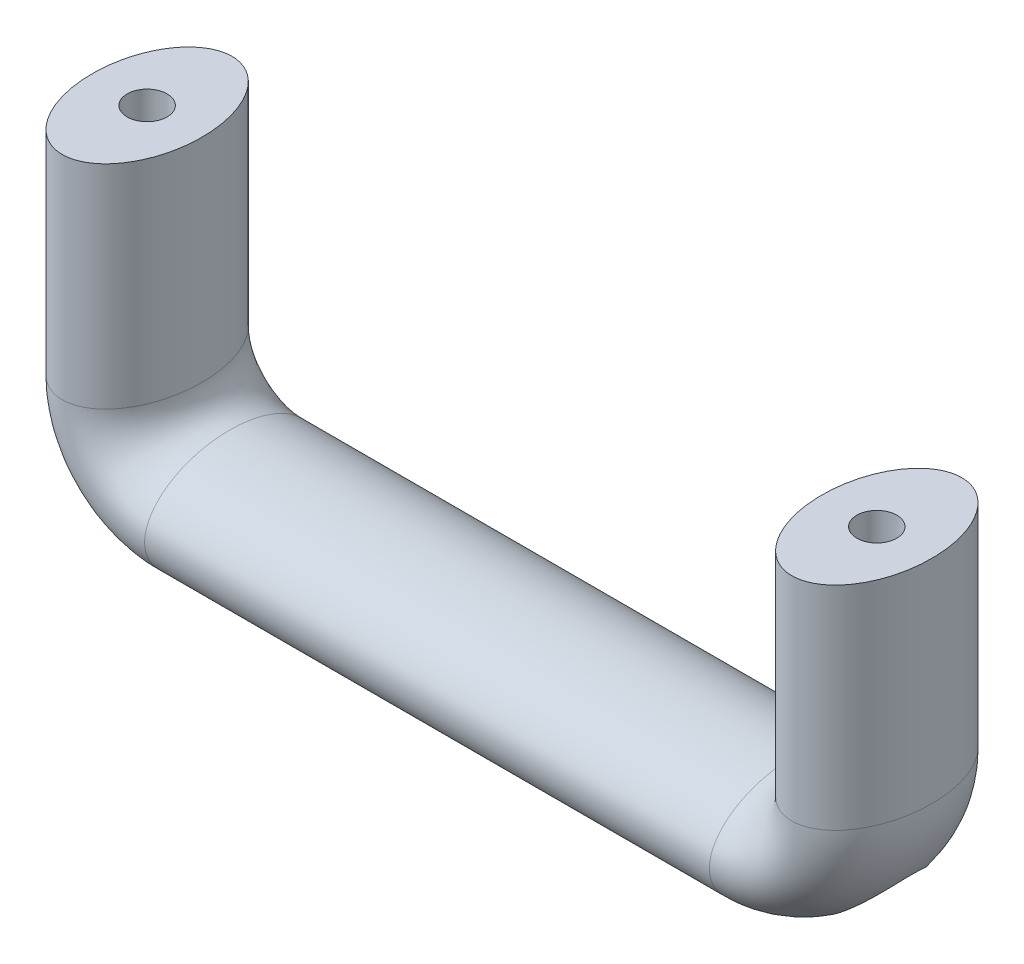
ISO-10303-21;
HEADER;
FILE_DESCRIPTION(('STEP AP214'),'2;1');
FILE_NAME('part.step','',(''),(''),'','','');
FILE_SCHEMA(('AUTOMOTIVE_DESIGN { 1 0 10303 214 1 1 1 1 }'));
ENDSEC;
DATA;
#1=APPLICATION_CONTEXT('core data for automotive mechanical design processes');
#2=APPLICATION_PROTOCOL_DEFINITION('international standard','automotive_design',2000,#1);
#3=PRODUCT_CONTEXT('',#1,'mechanical');
#4=PRODUCT('Part','Part','',(#3));
#5=PRODUCT_RELATED_PRODUCT_CATEGORY('part','',(#4));
#6=PRODUCT_DEFINITION_FORMATION('','',#4);
#7=PRODUCT_DEFINITION_CONTEXT('part definition',#1,'design');
#8=PRODUCT_DEFINITION('design','',#6,#7);
#9=PRODUCT_DEFINITION_SHAPE('','',#8);
#10=(LENGTH_UNIT() NAMED_UNIT(*) SI_UNIT(.MILLI.,.METRE.));
#11=(NAMED_UNIT(*) PLANE_ANGLE_UNIT() SI_UNIT($,.RADIAN.));
#12=(NAMED_UNIT(*) SI_UNIT($,.STERADIAN.) SOLID_ANGLE_UNIT());
#13=UNCERTAINTY_MEASURE_WITH_UNIT(LENGTH_MEASURE(1.E-05),#10,'distance_accuracy_value','');
#14=(GEOMETRIC_REPRESENTATION_CONTEXT(3) GLOBAL_UNCERTAINTY_ASSIGNED_CONTEXT((#13)) GLOBAL_UNIT_ASSIGNED_CONTEXT((#10,
#11,#12)) REPRESENTATION_CONTEXT('',''));
#15=CARTESIAN_POINT('',(0.,0.,0.));
#16=DIRECTION('',(0.,0.,1.));
#17=DIRECTION('',(1.,0.,0.));
#18=AXIS2_PLACEMENT_3D('',#15,#16,#17);
#19=CARTESIAN_POINT('',(44.846875,0.,0.));
#20=DIRECTION('',(-1.,0.,0.));
#21=DIRECTION('',(0.,0.,-1.));
#22=AXIS2_PLACEMENT_3D('',#19,#20,#21);
#23=ELLIPSE('',#22,13.49375,8.73125);
#24=CARTESIAN_POINT('',(44.846875,13.096875,0.));
#25=DIRECTION('',(0.,0.,1.));
#26=AXIS1_PLACEMENT('',#24,#25);
#27=SURFACE_OF_REVOLUTION('',#23,#26);
#28=CARTESIAN_POINT('',(57.94375,13.096875,0.));
#29=DIRECTION('',(0.,-1.,0.));
#30=DIRECTION('',(0.,0.,-1.));
#31=AXIS2_PLACEMENT_3D('',#28,#29,#30);
#32=ELLIPSE('',#31,13.49375,8.73125);
#33=CARTESIAN_POINT('',(57.94375,13.096875,-13.49375));
#34=VERTEX_POINT('',#33);
#35=EDGE_CURVE('E42',#34,#34,#32,.T.);
#36=ORIENTED_EDGE('',*,*,#35,.T.);
#37=EDGE_LOOP('',(#36));
#38=FACE_BOUND('',#37,.T.);
#39=CARTESIAN_POINT('',(44.846875,0.,-13.49375));
#40=VERTEX_POINT('',#39);
#41=EDGE_CURVE('E47',#40,#40,#23,.T.);
#42=ORIENTED_EDGE('',*,*,#41,.F.);
#43=EDGE_LOOP('',(#42));
#44=FACE_BOUND('',#43,.T.);
#45=CARTESIAN_POINT('',(57.94375,-3.35139645855794,5.65113228089492));
#46=CARTESIAN_POINT('',(57.5746862352443,-3.64331484991546,5.65622519553315));
#47=CARTESIAN_POINT('',(57.2017922048101,-3.93187821364346,5.62510913077977));
#48=CARTESIAN_POINT('',(56.4591436932699,-4.49534407066536,5.48636690939444));
#49=CARTESIAN_POINT('',(56.089392824493,-4.77023224919793,5.37866231327861));
#50=CARTESIAN_POINT('',(55.4301100486153,-5.25161833408054,5.10845063150673));
#51=CARTESIAN_POINT('',(55.1379149551523,-5.46163688524343,4.95892865764341));
#52=CARTESIAN_POINT('',(54.7156864742835,-5.76098728724267,4.69252106700156));
#53=CARTESIAN_POINT('',(54.5776550010241,-5.85813449635496,4.5967283140944));
#54=CARTESIAN_POINT('',(54.3082135148788,-6.04651114356533,4.39098811090377));
#55=CARTESIAN_POINT('',(54.1768022596839,-6.13774169287724,4.2810433301717));
#56=CARTESIAN_POINT('',(53.9431283241811,-6.29894968395207,4.06636693460569));
#57=CARTESIAN_POINT('',(53.8396258322547,-6.36995509553836,3.96375092498246));
#58=CARTESIAN_POINT('',(53.639330432146,-6.5066811680028,3.74891159318105));
#59=CARTESIAN_POINT('',(53.5425362634089,-6.57240282212045,3.63669008486975));
#60=CARTESIAN_POINT('',(53.3566565258166,-6.69803060520064,3.40291296489685));
#61=CARTESIAN_POINT('',(53.2675730277214,-6.75793517246283,3.28135486226144));
#62=CARTESIAN_POINT('',(53.0982542633905,-6.87131706059435,3.02946746882609));
#63=CARTESIAN_POINT('',(53.0180151394527,-6.92479718457222,2.89914204238443));
#64=CARTESIAN_POINT('',(52.8668596930951,-7.02517009004666,2.62934311436904));
#65=CARTESIAN_POINT('',(52.7960171936901,-7.07201088746454,2.48980875149418));
#66=CARTESIAN_POINT('',(52.6654662066914,-7.15805644554019,2.20344311700573));
#67=CARTESIAN_POINT('',(52.6057522043009,-7.19726498884077,2.05661550554288));
#68=CARTESIAN_POINT('',(52.4984160823366,-7.26756242855203,1.75677062058317));
#69=CARTESIAN_POINT('',(52.4507901219438,-7.29865390414604,1.60375533110088));
#70=CARTESIAN_POINT('',(52.3684557004544,-7.35230331972591,1.29283525150155));
#71=CARTESIAN_POINT('',(52.3337453548846,-7.37486250463711,1.13493117833494));
#72=CARTESIAN_POINT('',(52.2813317265114,-7.40888813089281,0.835452004227387));
#73=CARTESIAN_POINT('',(52.2620586546155,-7.42137968036328,0.69426552081927));
#74=CARTESIAN_POINT('',(52.2342159663788,-7.43941705334638,0.410404859934935));
#75=CARTESIAN_POINT('',(52.2256454135125,-7.4449634845928,0.267730813729984));
#76=CARTESIAN_POINT('',(52.2193387909664,-7.44904531121297,-0.0179023497551686));
#77=CARTESIAN_POINT('',(52.2215987221754,-7.44758329442709,-0.160861342332628));
#78=CARTESIAN_POINT('',(52.236909290931,-7.4376714198211,-0.445955303378311));
#79=CARTESIAN_POINT('',(52.249959708039,-7.42922170475251,-0.588090288620429));
#80=CARTESIAN_POINT('',(52.2855116547916,-7.40617326468082,-0.861629296697843));
#81=CARTESIAN_POINT('',(52.3073763540154,-7.39198871127046,-0.993151838559297));
#82=CARTESIAN_POINT('',(52.3601456751799,-7.35769761074963,-1.25362761654654));
#83=CARTESIAN_POINT('',(52.3910531775246,-7.33758917669139,-1.38258002000516));
#84=CARTESIAN_POINT('',(52.4615051732639,-7.29165506418565,-1.63700242977126));
#85=CARTESIAN_POINT('',(52.5010464568889,-7.26583151039233,-1.76247371076497));
#86=CARTESIAN_POINT('',(52.5883155590524,-7.20869165922185,-2.00929565450592));
#87=CARTESIAN_POINT('',(52.6360464806332,-7.17737327976105,-2.1306447344017));
#88=CARTESIAN_POINT('',(52.7409092281882,-7.10836418517364,-2.37259129045033));
#89=CARTESIAN_POINT('',(52.7983057148844,-7.07049287205383,-2.49302262966009));
#90=CARTESIAN_POINT('',(52.9206332922722,-6.98950038382196,-2.72817706646486));
#91=CARTESIAN_POINT('',(52.9855670871499,-6.94637732424806,-2.84289809412894));
#92=CARTESIAN_POINT('',(53.1906646485962,-6.80965232774162,-3.17769692485344));
#93=CARTESIAN_POINT('',(53.3411885450254,-6.70865270849993,-3.38855576181128));
#94=CARTESIAN_POINT('',(53.6822529254597,-6.47771845915544,-3.80459845382586));
#95=CARTESIAN_POINT('',(53.8753828964691,-6.34581423256014,-4.00653633013496));
#96=CARTESIAN_POINT('',(54.2820021722722,-6.06501802974557,-4.37490856480491));
#97=CARTESIAN_POINT('',(54.4955017713485,-5.91611745646769,-4.54132483246578));
#98=CARTESIAN_POINT('',(54.9731854477444,-5.57905116058154,-4.86292076445452));
#99=CARTESIAN_POINT('',(55.2399276665458,-5.38845665352498,-5.01174165344912));
#100=CARTESIAN_POINT('',(55.7849824122992,-4.99338149729163,-5.26211568687435));
#101=CARTESIAN_POINT('',(56.0633024375841,-4.78889179287347,-5.36363766232649));
#102=CARTESIAN_POINT('',(56.6773693074658,-4.33090574373172,-5.5357665841157));
#103=CARTESIAN_POINT('',(57.0141848062598,-4.07535928850034,-5.59713498962475));
#104=CARTESIAN_POINT('',(57.6864527775785,-3.55554816853501,-5.65893024440136));
#105=CARTESIAN_POINT('',(58.0219046675849,-3.29128014409589,-5.65933332806654));
#106=CARTESIAN_POINT('',(58.7361811143557,-2.71688721523872,-5.59730819310959));
#107=CARTESIAN_POINT('',(59.1136322098959,-2.4060255677166,-5.52509314704713));
#108=CARTESIAN_POINT('',(59.663871599542,-1.94084695002296,-5.36056189575608));
#109=CARTESIAN_POINT('',(59.8448698444611,-1.785757475468,-5.29622084456571));
#110=CARTESIAN_POINT('',(60.2003128045396,-1.47694966583241,-5.14892791016937));
#111=CARTESIAN_POINT('',(60.3747600309393,-1.32323082293248,-5.06598324519564));
#112=CARTESIAN_POINT('',(60.7263340105782,-1.00891185445445,-4.87590219489734));
#113=CARTESIAN_POINT('',(60.9029683594406,-0.848468263753688,-4.76759368315906));
#114=CARTESIAN_POINT('',(61.2459200446552,-0.531954610887161,-4.52997681915638));
#115=CARTESIAN_POINT('',(61.4122340036779,-0.375885989487468,-4.40066164206158));
#116=CARTESIAN_POINT('',(61.7322144312152,-0.0707069763788393,-4.12115393523975));
#117=CARTESIAN_POINT('',(61.8859127593697,0.0784205040987224,-3.97101674454352));
#118=CARTESIAN_POINT('',(62.1788534631866,0.367263300217282,-3.64925507373258));
#119=CARTESIAN_POINT('',(62.318108852157,0.506987048195195,-3.47765024938209));
#120=CARTESIAN_POINT('',(62.520541466433,0.71324224821284,-3.19478111562703));
#121=CARTESIAN_POINT('',(62.5897356928283,0.784395946510264,-3.09114975672581));
#122=CARTESIAN_POINT('',(62.7223648886976,0.921905785578775,-2.87724289540268));
#123=CARTESIAN_POINT('',(62.785798808676,0.988261051655594,-2.76696618829985));
#124=CARTESIAN_POINT('',(62.9663148135529,1.17856811983095,-2.4264104764598));
#125=CARTESIAN_POINT('',(63.0739632488377,1.29412237704825,-2.1859228820124));
#126=CARTESIAN_POINT('',(63.2030292914658,1.43425766855676,-1.83036491673055));
#127=CARTESIAN_POINT('',(63.2378141205121,1.47224781543923,-1.72515384237925));
#128=CARTESIAN_POINT('',(63.3015824159837,1.5421909780118,-1.51104585144048));
#129=CARTESIAN_POINT('',(63.3305687495886,1.57414697696395,-1.4021507877716));
#130=CARTESIAN_POINT('',(63.3822687215338,1.63134047865389,-1.18120331796847));
#131=CARTESIAN_POINT('',(63.4049852535588,1.65658108053637,-1.06915239475343));
#132=CARTESIAN_POINT('',(63.4437475352799,1.6997566265956,-0.842502193013307));
#133=CARTESIAN_POINT('',(63.4597932831257,1.71769156874594,-0.727902913781377));
#134=CARTESIAN_POINT('',(63.4849567556749,1.74585732570925,-0.496281963698674));
#135=CARTESIAN_POINT('',(63.4940316510284,1.75604050985405,-0.37924978461998));
#136=CARTESIAN_POINT('',(63.504885835534,1.76822366824493,-0.144419204378824));
#137=CARTESIAN_POINT('',(63.5066651437777,1.77022366390523,-0.0266208052222572));
#138=CARTESIAN_POINT('',(63.5028866488298,1.76598021005941,0.208706432723477));
#139=CARTESIAN_POINT('',(63.497328902332,1.7597368242503,0.326235273588504));
#140=CARTESIAN_POINT('',(63.4790048378968,1.73919309326544,0.560010934420706));
#141=CARTESIAN_POINT('',(63.4662387259382,1.72489297831064,0.676257790923801));
#142=CARTESIAN_POINT('',(63.4352629582737,1.69030051110051,0.896022802814127));
#143=CARTESIAN_POINT('',(63.4176577017692,1.67067554620761,0.999733007849442));
#144=CARTESIAN_POINT('',(63.3770172770203,1.62553178099309,1.2047939894004));
#145=CARTESIAN_POINT('',(63.3539805031205,1.60001123787651,1.30614405846358));
#146=CARTESIAN_POINT('',(63.2772276330673,1.51533734959317,1.60589935539579));
#147=CARTESIAN_POINT('',(63.2158562157328,1.44805730120443,1.80009736744077));
#148=CARTESIAN_POINT('',(63.0431441158188,1.2608942461327,2.26133004651359));
#149=CARTESIAN_POINT('',(62.9218156028281,1.13106722060269,2.52058688298708));
#150=CARTESIAN_POINT('',(62.7178680048301,0.917197851565908,2.88549522176264));
#151=CARTESIAN_POINT('',(62.6460978115208,0.842589202424818,3.00329928082404));
#152=CARTESIAN_POINT('',(62.4959573769173,0.688046768843261,3.23099585070756));
#153=CARTESIAN_POINT('',(62.4175870588503,0.608112922462228,3.3408882694737));
#154=CARTESIAN_POINT('',(62.2238402615612,0.412501351146365,3.59332867813045));
#155=CARTESIAN_POINT('',(62.1057773551536,0.294849029071406,3.73228418476919));
#156=CARTESIAN_POINT('',(61.8599051920726,0.0533210061801411,3.99540923799337));
#157=CARTESIAN_POINT('',(61.7320922810649,-0.0705570220575956,4.11957319554807));
#158=CARTESIAN_POINT('',(61.4678839873147,-0.323026521376802,4.35342033010985));
#159=CARTESIAN_POINT('',(61.3314812645225,-0.451621983270919,4.46309086752118));
#160=CARTESIAN_POINT('',(61.0512904612334,-0.712145439635563,4.6679813489947));
#161=CARTESIAN_POINT('',(60.9075033063041,-0.844073015409268,4.76320309818592));
#162=CARTESIAN_POINT('',(60.6098205027622,-1.11357558010536,4.94148055930924));
#163=CARTESIAN_POINT('',(60.4557627628513,-1.25120953313015,5.02417691887301));
#164=CARTESIAN_POINT('',(60.14179911891,-1.52805269888568,5.17450483365191));
#165=CARTESIAN_POINT('',(59.9818908910877,-1.66726252204687,5.24213032546185));
#166=CARTESIAN_POINT('',(59.4954217241965,-2.08548130845453,5.42195289411207));
#167=CARTESIAN_POINT('',(59.1612453860202,-2.36586798938232,5.51161256803678));
#168=CARTESIAN_POINT('',(58.6768021254843,-2.76325372293138,5.59495137368489));
#169=CARTESIAN_POINT('',(58.5313675977308,-2.8814237919284,5.61417225347589));
#170=CARTESIAN_POINT('',(58.2387440143734,-3.11704100408854,5.64124554992532));
#171=CARTESIAN_POINT('',(58.0915541705862,-3.23448778359762,5.64909264954702));
#172=CARTESIAN_POINT('',(57.94375,-3.35139645855794,5.65113228089492));
#173=B_SPLINE_CURVE_WITH_KNOTS('',3,(#45,#46,#47,#48,#49,#50,#51,#52,#53,#54,#55,#56,#57,#58,
#59,#60,#61,#62,#63,#64,#65,#66,#67,#68,#69,#70,#71,#72,#73,#74,#75,#76,#77,#78,#79,#80,#81,#82,
#83,#84,#85,#86,#87,#88,#89,#90,#91,#92,#93,#94,#95,#96,#97,#98,#99,#100,#101,#102,#103,#104,
#105,#106,#107,#108,#109,#110,#111,#112,#113,#114,#115,#116,#117,#118,#119,#120,#121,#122,#123,
#124,#125,#126,#127,#128,#129,#130,#131,#132,#133,#134,#135,#136,#137,#138,#139,#140,#141,#142,
#143,#144,#145,#146,#147,#148,#149,#150,#151,#152,#153,#154,#155,#156,#157,#158,#159,#160,#161,
#162,#163,#164,#165,#166,#167,#168,#169,#170,#171,#172),.UNSPECIFIED.,.T.,.F.,(4,2,2,2,2,2,2,2,
2,2,2,2,2,2,2,2,2,2,2,2,2,2,2,2,2,2,2,2,2,2,2,2,2,2,2,2,2,2,2,2,2,2,2,2,2,2,2,2,2,2,2,2,2,2,2,2,
2,2,2,2,2,2,2,4),(0.,1.41111007229615,2.82366744301005,3.98755962621132,4.56920162734131,
5.15073407145271,5.63664129605417,6.12245696531231,6.60840270190919,7.09413563490757,
7.58348333757699,8.07258789229663,8.56153684526881,9.0504144293666,9.47898354810835,
9.90751516221341,10.335888554988,10.7642531967485,11.1660323126791,11.5679395468991,
11.9696976182315,12.3716082526611,12.7871973631257,13.2029360394884,14.0339260934466,
14.9574416515499,15.8814264279707,16.9575059262115,18.0342935384597,19.3109886092656,
20.5881813621692,22.064115807902,22.8041507155958,23.5438989837466,24.3290389040961,
25.1144344196622,25.89778121059,26.6804159478302,27.1105641551174,27.5407905764215,
28.3991658149661,28.7503324785309,29.1013250693082,29.4521553954991,29.8029858190017,
30.1559548969575,30.5089230512436,30.8618884781437,31.2148438195718,31.5355294349061,
31.8563099698643,32.4976045519201,33.4350446215554,33.9052262883417,34.3754134250483,
35.0254955241874,35.6758224848663,36.3267128996194,36.9775219296739,37.6444351547059,
38.3116162139519,39.6421618319169,40.2070250044675,40.772152155272),.UNSPECIFIED.);
#174=CARTESIAN_POINT('',(57.94375,-3.35139645855794,5.65113228089492));
#175=VERTEX_POINT('',#174);
#176=EDGE_CURVE('E35',#175,#175,#173,.T.);
#177=ORIENTED_EDGE('',*,*,#176,.F.);
#178=EDGE_LOOP('',(#177));
#179=FACE_BOUND('',#178,.T.);
#180=ADVANCED_FACE('F30',(#38,#44,#179),#27,.T.);
#181=CARTESIAN_POINT('',(57.94375,46.83125,0.));
#182=DIRECTION('',(0.,-1.,0.));
#183=DIRECTION('',(0.,0.,1.));
#184=AXIS2_PLACEMENT_3D('',#181,#182,#183);
#185=PLANE('',#184);
#186=CARTESIAN_POINT('',(57.94375,46.83125,0.));
#187=DIRECTION('',(0.,-1.,0.));
#188=DIRECTION('',(0.,0.,-1.));
#189=AXIS2_PLACEMENT_3D('',#186,#187,#188);
#190=ELLIPSE('',#189,13.49375,8.73125);
#191=CARTESIAN_POINT('',(57.94375,46.83125,-13.49375));
#192=VERTEX_POINT('',#191);
#193=EDGE_CURVE('E10',#192,#192,#190,.T.);
#194=ORIENTED_EDGE('',*,*,#193,.F.);
#195=EDGE_LOOP('',(#194));
#196=FACE_BOUND('',#195,.T.);
#197=CARTESIAN_POINT('',(57.94375,46.83125,0.));
#198=DIRECTION('',(0.,-1.,0.));
#199=DIRECTION('',(0.,0.,1.));
#200=AXIS2_PLACEMENT_3D('',#197,#198,#199);
#201=CIRCLE('',#200,3.17499999999997);
#202=CARTESIAN_POINT('',(57.94375,46.83125,3.17499999999997));
#203=VERTEX_POINT('',#202);
#204=EDGE_CURVE('E121',#203,#203,#201,.T.);
#205=ORIENTED_EDGE('',*,*,#204,.T.);
#206=EDGE_LOOP('',(#205));
#207=FACE_BOUND('',#206,.T.);
#208=ADVANCED_FACE('F82',(#196,#207),#185,.F.);
#209=DIRECTION('',(0.,1.,0.));
#210=VECTOR('',#209,1.);
#211=SURFACE_OF_LINEAR_EXTRUSION('',#32,#210);
#212=ORIENTED_EDGE('',*,*,#35,.F.);
#213=EDGE_LOOP('',(#212));
#214=FACE_BOUND('',#213,.T.);
#215=ORIENTED_EDGE('',*,*,#193,.T.);
#216=EDGE_LOOP('',(#215));
#217=FACE_BOUND('',#216,.T.);
#218=ADVANCED_FACE('F32',(#214,#217),#211,.F.);
#219=CARTESIAN_POINT('',(-44.846875,0.,0.));
#220=DIRECTION('',(-1.,0.,0.));
#221=DIRECTION('',(0.,0.,-1.));
#222=AXIS2_PLACEMENT_3D('',#219,#220,#221);
#223=ELLIPSE('',#222,13.49375,8.73125);
#224=DIRECTION('',(1.,0.,0.));
#225=VECTOR('',#224,1.);
#226=SURFACE_OF_LINEAR_EXTRUSION('',#223,#225);
#227=CARTESIAN_POINT('',(-44.846875,0.,-13.49375));
#228=VERTEX_POINT('',#227);
#229=EDGE_CURVE('E96',#228,#228,#223,.T.);
#230=ORIENTED_EDGE('',*,*,#229,.F.);
#231=EDGE_LOOP('',(#230));
#232=FACE_BOUND('',#231,.T.);
#233=ORIENTED_EDGE('',*,*,#41,.T.);
#234=EDGE_LOOP('',(#233));
#235=FACE_BOUND('',#234,.T.);
#236=ADVANCED_FACE('F105',(#232,#235),#226,.F.);
#237=CARTESIAN_POINT('',(-57.94375,13.096875,0.));
#238=DIRECTION('',(0.,1.,0.));
#239=DIRECTION('',(0.,0.,-1.));
#240=AXIS2_PLACEMENT_3D('',#237,#238,#239);
#241=ELLIPSE('',#240,13.49375,8.73125);
#242=CARTESIAN_POINT('',(-44.846875,13.096875,0.));
#243=DIRECTION('',(0.,0.,1.));
#244=AXIS1_PLACEMENT('',#242,#243);
#245=SURFACE_OF_REVOLUTION('',#241,#244);
#246=CARTESIAN_POINT('',(-57.94375,-3.35139645855795,5.65113228089492));
#247=CARTESIAN_POINT('',(-57.5746862352443,-3.64331484991546,5.65622519553315));
#248=CARTESIAN_POINT('',(-57.2017922048101,-3.93187821364346,5.62510913077977));
#249=CARTESIAN_POINT('',(-56.4591436932699,-4.49534407066536,5.48636690939444));
#250=CARTESIAN_POINT('',(-56.089392824493,-4.77023224919793,5.37866231327861));
#251=CARTESIAN_POINT('',(-55.4301100486153,-5.25161833408054,5.10845063150673));
#252=CARTESIAN_POINT('',(-55.1379149551523,-5.46163688524343,4.9589286576434));
#253=CARTESIAN_POINT('',(-54.7156864742835,-5.76098728724268,4.69252106700156));
#254=CARTESIAN_POINT('',(-54.5776550010241,-5.85813449635496,4.5967283140944));
#255=CARTESIAN_POINT('',(-54.3082135148788,-6.04651114356534,4.39098811090378));
#256=CARTESIAN_POINT('',(-54.1768022596839,-6.13774169287725,4.28104333017171));
#257=CARTESIAN_POINT('',(-53.9431283241811,-6.29894968395207,4.06636693460569));
#258=CARTESIAN_POINT('',(-53.8396258322547,-6.36995509553836,3.96375092498246));
#259=CARTESIAN_POINT('',(-53.639330432146,-6.50668116800279,3.74891159318105));
#260=CARTESIAN_POINT('',(-53.5425362634089,-6.57240282212044,3.63669008486976));
#261=CARTESIAN_POINT('',(-53.3566565258166,-6.69803060520064,3.40291296489686));
#262=CARTESIAN_POINT('',(-53.2675730277214,-6.75793517246283,3.28135486226144));
#263=CARTESIAN_POINT('',(-53.0982542633905,-6.87131706059435,3.0294674688261));
#264=CARTESIAN_POINT('',(-53.0180151394527,-6.92479718457222,2.89914204238444));
#265=CARTESIAN_POINT('',(-52.8668596930951,-7.02517009004666,2.62934311436904));
#266=CARTESIAN_POINT('',(-52.7960171936901,-7.07201088746455,2.48980875149418));
#267=CARTESIAN_POINT('',(-52.6654662066914,-7.1580564455402,2.20344311700574));
#268=CARTESIAN_POINT('',(-52.6057522043009,-7.19726498884078,2.05661550554288));
#269=CARTESIAN_POINT('',(-52.4984160823366,-7.26756242855203,1.75677062058317));
#270=CARTESIAN_POINT('',(-52.4507901219438,-7.29865390414605,1.60375533110088));
#271=CARTESIAN_POINT('',(-52.3684557004544,-7.35230331972592,1.29283525150155));
#272=CARTESIAN_POINT('',(-52.3337453548846,-7.37486250463711,1.13493117833494));
#273=CARTESIAN_POINT('',(-52.2813317265114,-7.40888813089282,0.835452004227387));
#274=CARTESIAN_POINT('',(-52.2620586546155,-7.42137968036328,0.69426552081927));
#275=CARTESIAN_POINT('',(-52.2342159663788,-7.43941705334638,0.410404859934936));
#276=CARTESIAN_POINT('',(-52.2256454135125,-7.4449634845928,0.267730813729984));
#277=CARTESIAN_POINT('',(-52.2193387909664,-7.44904531121297,-0.0179023497551689));
#278=CARTESIAN_POINT('',(-52.2215987221754,-7.4475832944271,-0.160861342332629));
#279=CARTESIAN_POINT('',(-52.236909290931,-7.43767141982112,-0.445955303378312));
#280=CARTESIAN_POINT('',(-52.249959708039,-7.42922170475252,-0.588090288620428));
#281=CARTESIAN_POINT('',(-52.2855116547917,-7.40617326468083,-0.861629296697843));
#282=CARTESIAN_POINT('',(-52.3073763540154,-7.39198871127047,-0.993151838559298));
#283=CARTESIAN_POINT('',(-52.3601456751799,-7.35769761074963,-1.25362761654654));
#284=CARTESIAN_POINT('',(-52.3910531775246,-7.33758917669139,-1.38258002000516));
#285=CARTESIAN_POINT('',(-52.4615051732639,-7.29165506418566,-1.63700242977126));
#286=CARTESIAN_POINT('',(-52.5010464568889,-7.26583151039234,-1.76247371076497));
#287=CARTESIAN_POINT('',(-52.5883155590524,-7.20869165922187,-2.00929565450592));
#288=CARTESIAN_POINT('',(-52.6360464806332,-7.17737327976107,-2.1306447344017));
#289=CARTESIAN_POINT('',(-52.7409092281882,-7.10836418517365,-2.37259129045032));
#290=CARTESIAN_POINT('',(-52.7983057148844,-7.07049287205383,-2.49302262966009));
#291=CARTESIAN_POINT('',(-52.9206332922722,-6.98950038382197,-2.72817706646486));
#292=CARTESIAN_POINT('',(-52.9855670871499,-6.94637732424807,-2.84289809412894));
#293=CARTESIAN_POINT('',(-53.1906646485962,-6.80965232774163,-3.17769692485344));
#294=CARTESIAN_POINT('',(-53.3411885450254,-6.70865270849994,-3.38855576181128));
#295=CARTESIAN_POINT('',(-53.6822529254597,-6.47771845915545,-3.80459845382586));
#296=CARTESIAN_POINT('',(-53.8753828964691,-6.34581423256016,-4.00653633013496));
#297=CARTESIAN_POINT('',(-54.2820021722722,-6.06501802974558,-4.37490856480491));
#298=CARTESIAN_POINT('',(-54.4955017713485,-5.9161174564677,-4.54132483246578));
#299=CARTESIAN_POINT('',(-54.9731854477444,-5.57905116058154,-4.86292076445452));
#300=CARTESIAN_POINT('',(-55.2399276665458,-5.38845665352498,-5.01174165344912));
#301=CARTESIAN_POINT('',(-55.7849824122992,-4.99338149729163,-5.26211568687435));
#302=CARTESIAN_POINT('',(-56.0633024375841,-4.78889179287347,-5.36363766232649));
#303=CARTESIAN_POINT('',(-56.6773693074658,-4.33090574373172,-5.5357665841157));
#304=CARTESIAN_POINT('',(-57.0141848062598,-4.07535928850034,-5.59713498962475));
#305=CARTESIAN_POINT('',(-57.6864527775785,-3.55554816853502,-5.65893024440136));
#306=CARTESIAN_POINT('',(-58.0219046675849,-3.29128014409589,-5.65933332806654));
#307=CARTESIAN_POINT('',(-58.7361811143557,-2.71688721523873,-5.59730819310959));
#308=CARTESIAN_POINT('',(-59.1136322098959,-2.40602556771662,-5.52509314704713));
#309=CARTESIAN_POINT('',(-59.663871599542,-1.94084695002298,-5.36056189575607));
#310=CARTESIAN_POINT('',(-59.8448698444611,-1.78575747546801,-5.29622084456571));
#311=CARTESIAN_POINT('',(-60.2003128045396,-1.47694966583242,-5.14892791016937));
#312=CARTESIAN_POINT('',(-60.3747600309393,-1.32323082293249,-5.06598324519564));
#313=CARTESIAN_POINT('',(-60.7263340105782,-1.00891185445446,-4.87590219489734));
#314=CARTESIAN_POINT('',(-60.9029683594406,-0.848468263753693,-4.76759368315906));
#315=CARTESIAN_POINT('',(-61.2459200446552,-0.531954610887166,-4.52997681915637));
#316=CARTESIAN_POINT('',(-61.4122340036779,-0.375885989487475,-4.40066164206158));
#317=CARTESIAN_POINT('',(-61.7322144312152,-0.0707069763788457,-4.12115393523975));
#318=CARTESIAN_POINT('',(-61.8859127593697,0.0784205040987181,-3.97101674454351));
#319=CARTESIAN_POINT('',(-62.1788534631866,0.367263300217278,-3.64925507373258));
#320=CARTESIAN_POINT('',(-62.318108852157,0.506987048195189,-3.47765024938209));
#321=CARTESIAN_POINT('',(-62.520541466433,0.713242248212834,-3.19478111562704));
#322=CARTESIAN_POINT('',(-62.5897356928283,0.784395946510259,-3.09114975672581));
#323=CARTESIAN_POINT('',(-62.7223648886976,0.921905785578769,-2.87724289540269));
#324=CARTESIAN_POINT('',(-62.785798808676,0.988261051655586,-2.76696618829986));
#325=CARTESIAN_POINT('',(-62.9663148135529,1.17856811983094,-2.4264104764598));
#326=CARTESIAN_POINT('',(-63.0739632488377,1.29412237704824,-2.18592288201241));
#327=CARTESIAN_POINT('',(-63.2030292914658,1.43425766855675,-1.83036491673055));
#328=CARTESIAN_POINT('',(-63.2378141205121,1.47224781543921,-1.72515384237926));
#329=CARTESIAN_POINT('',(-63.3015824159837,1.54219097801178,-1.51104585144048));
#330=CARTESIAN_POINT('',(-63.3305687495886,1.57414697696393,-1.4021507877716));
#331=CARTESIAN_POINT('',(-63.3822687215338,1.63134047865387,-1.18120331796847));
#332=CARTESIAN_POINT('',(-63.4049852535588,1.65658108053634,-1.06915239475343));
#333=CARTESIAN_POINT('',(-63.4437475352799,1.69975662659558,-0.842502193013307));
#334=CARTESIAN_POINT('',(-63.4597932831257,1.71769156874593,-0.727902913781377));
#335=CARTESIAN_POINT('',(-63.4849567556749,1.74585732570923,-0.496281963698673));
#336=CARTESIAN_POINT('',(-63.4940316510284,1.75604050985402,-0.379249784619979));
#337=CARTESIAN_POINT('',(-63.504885835534,1.7682236682449,-0.144419204378823));
#338=CARTESIAN_POINT('',(-63.5066651437777,1.77022366390523,-0.0266208052222566));
#339=CARTESIAN_POINT('',(-63.5028866488298,1.76598021005942,0.208706432723476));
#340=CARTESIAN_POINT('',(-63.4973289023321,1.75973682425029,0.326235273588503));
#341=CARTESIAN_POINT('',(-63.4790048378968,1.73919309326542,0.560010934420705));
#342=CARTESIAN_POINT('',(-63.4662387259382,1.72489297831063,0.676257790923801));
#343=CARTESIAN_POINT('',(-63.4352629582737,1.6903005111005,0.896022802814126));
#344=CARTESIAN_POINT('',(-63.4176577017692,1.67067554620759,0.99973300784944));
#345=CARTESIAN_POINT('',(-63.3770172770203,1.62553178099309,1.20479398940041));
#346=CARTESIAN_POINT('',(-63.3539805031206,1.60001123787653,1.30614405846359));
#347=CARTESIAN_POINT('',(-63.2772276330673,1.51533734959323,1.60589935539581));
#348=CARTESIAN_POINT('',(-63.2158562157329,1.44805730120446,1.80009736744078));
#349=CARTESIAN_POINT('',(-63.0431441158188,1.26089424613268,2.26133004651359));
#350=CARTESIAN_POINT('',(-62.9218156028281,1.13106722060268,2.52058688298708));
#351=CARTESIAN_POINT('',(-62.7178680048301,0.917197851565909,2.88549522176265));
#352=CARTESIAN_POINT('',(-62.6460978115208,0.842589202424817,3.00329928082405));
#353=CARTESIAN_POINT('',(-62.4959573769173,0.688046768843254,3.23099585070757));
#354=CARTESIAN_POINT('',(-62.4175870588503,0.608112922462219,3.3408882694737));
#355=CARTESIAN_POINT('',(-62.2238402615612,0.412501351146352,3.59332867813046));
#356=CARTESIAN_POINT('',(-62.1057773551536,0.294849029071394,3.73228418476919));
#357=CARTESIAN_POINT('',(-61.8599051920726,0.0533210061801335,3.99540923799337));
#358=CARTESIAN_POINT('',(-61.7320922810649,-0.0705570220576004,4.11957319554807));
#359=CARTESIAN_POINT('',(-61.4678839873147,-0.323026521376808,4.35342033010985));
#360=CARTESIAN_POINT('',(-61.3314812645225,-0.451621983270929,4.46309086752117));
#361=CARTESIAN_POINT('',(-61.0512904612334,-0.712145439635572,4.66798134899469));
#362=CARTESIAN_POINT('',(-60.9075033063041,-0.844073015409271,4.76320309818592));
#363=CARTESIAN_POINT('',(-60.6098205027622,-1.11357558010536,4.94148055930924));
#364=CARTESIAN_POINT('',(-60.4557627628513,-1.25120953313015,5.02417691887301));
#365=CARTESIAN_POINT('',(-60.14179911891,-1.52805269888568,5.17450483365191));
#366=CARTESIAN_POINT('',(-59.9818908910877,-1.66726252204687,5.24213032546185));
#367=CARTESIAN_POINT('',(-59.4954217241965,-2.08548130845454,5.42195289411206));
#368=CARTESIAN_POINT('',(-59.1612453860202,-2.36586798938232,5.51161256803678));
#369=CARTESIAN_POINT('',(-58.6768021254843,-2.76325372293139,5.59495137368489));
#370=CARTESIAN_POINT('',(-58.5313675977308,-2.8814237919284,5.61417225347589));
#371=CARTESIAN_POINT('',(-58.2387440143734,-3.11704100408855,5.64124554992532));
#372=CARTESIAN_POINT('',(-58.0915541705862,-3.23448778359763,5.64909264954702));
#373=CARTESIAN_POINT('',(-57.94375,-3.35139645855795,5.65113228089492));
#374=B_SPLINE_CURVE_WITH_KNOTS('',3,(#246,#247,#248,#249,#250,#251,#252,#253,#254,#255,#256,
#257,#258,#259,#260,#261,#262,#263,#264,#265,#266,#267,#268,#269,#270,#271,#272,#273,#274,#275,
#276,#277,#278,#279,#280,#281,#282,#283,#284,#285,#286,#287,#288,#289,#290,#291,#292,#293,#294,
#295,#296,#297,#298,#299,#300,#301,#302,#303,#304,#305,#306,#307,#308,#309,#310,#311,#312,#313,
#314,#315,#316,#317,#318,#319,#320,#321,#322,#323,#324,#325,#326,#327,#328,#329,#330,#331,#332,
#333,#334,#335,#336,#337,#338,#339,#340,#341,#342,#343,#344,#345,#346,#347,#348,#349,#350,#351,
#352,#353,#354,#355,#356,#357,#358,#359,#360,#361,#362,#363,#364,#365,#366,#367,#368,#369,#370,
#371,#372,#373),.UNSPECIFIED.,.T.,.F.,(4,2,2,2,2,2,2,2,2,2,2,2,2,2,2,2,2,2,2,2,2,2,2,2,2,2,2,2,
2,2,2,2,2,2,2,2,2,2,2,2,2,2,2,2,2,2,2,2,2,2,2,2,2,2,2,2,2,2,2,2,2,2,2,4),(0.,1.41111007229615,
2.82366744301005,3.98755962621132,4.56920162734131,5.1507340714527,5.63664129605417,
6.1224569653123,6.60840270190918,7.09413563490756,7.58348333757698,8.07258789229663,
8.56153684526881,9.0504144293666,9.47898354810835,9.90751516221341,10.335888554988,
10.7642531967485,11.1660323126791,11.5679395468991,11.9696976182315,12.3716082526611,
12.7871973631257,13.2029360394884,14.0339260934466,14.9574416515499,15.8814264279707,
16.9575059262115,18.0342935384597,19.3109886092656,20.5881813621692,22.064115807902,
22.8041507155958,23.5438989837466,24.3290389040961,25.1144344196622,25.89778121059,
26.6804159478302,27.1105641551173,27.5407905764215,28.3991658149661,28.7503324785309,
29.1013250693082,29.452155395499,29.8029858190017,30.1559548969575,30.5089230512436,
30.8618884781437,31.2148438195718,31.535529434906,31.8563099698643,32.4976045519201,
33.4350446215554,33.9052262883417,34.3754134250483,35.0254955241874,35.6758224848663,
36.3267128996194,36.9775219296739,37.6444351547059,38.3116162139519,39.6421618319169,
40.2070250044675,40.772152155272),.UNSPECIFIED.);
#375=CARTESIAN_POINT('',(-57.94375,-3.35139645855795,5.65113228089492));
#376=VERTEX_POINT('',#375);
#377=EDGE_CURVE('E54',#376,#376,#374,.T.);
#378=ORIENTED_EDGE('',*,*,#377,.T.);
#379=EDGE_LOOP('',(#378));
#380=FACE_BOUND('',#379,.T.);
#381=CARTESIAN_POINT('',(-57.94375,13.096875,-13.49375));
#382=VERTEX_POINT('',#381);
#383=EDGE_CURVE('E91',#382,#382,#241,.T.);
#384=ORIENTED_EDGE('',*,*,#383,.F.);
#385=EDGE_LOOP('',(#384));
#386=FACE_BOUND('',#385,.T.);
#387=ORIENTED_EDGE('',*,*,#229,.T.);
#388=EDGE_LOOP('',(#387));
#389=FACE_BOUND('',#388,.T.);
#390=ADVANCED_FACE('F63',(#380,#386,#389),#245,.T.);
#391=DIRECTION('',(0.,1.,0.));
#392=VECTOR('',#391,1.);
#393=SURFACE_OF_LINEAR_EXTRUSION('',#241,#392);
#394=ORIENTED_EDGE('',*,*,#383,.T.);
#395=EDGE_LOOP('',(#394));
#396=FACE_BOUND('',#395,.T.);
#397=CARTESIAN_POINT('',(-57.94375,46.83125,0.));
#398=DIRECTION('',(0.,1.,0.));
#399=DIRECTION('',(0.,0.,-1.));
#400=AXIS2_PLACEMENT_3D('',#397,#398,#399);
#401=ELLIPSE('',#400,13.49375,8.73125);
#402=CARTESIAN_POINT('',(-57.94375,46.83125,-13.49375));
#403=VERTEX_POINT('',#402);
#404=EDGE_CURVE('E97',#403,#403,#401,.T.);
#405=ORIENTED_EDGE('',*,*,#404,.F.);
#406=EDGE_LOOP('',(#405));
#407=FACE_BOUND('',#406,.T.);
#408=ADVANCED_FACE('F87',(#396,#407),#393,.T.);
#409=CARTESIAN_POINT('',(-57.94375,46.83125,0.));
#410=DIRECTION('',(0.,1.,0.));
#411=DIRECTION('',(0.,0.,1.));
#412=AXIS2_PLACEMENT_3D('',#409,#410,#411);
#413=PLANE('',#412);
#414=CARTESIAN_POINT('',(-57.94375,46.83125,0.));
#415=DIRECTION('',(0.,1.,0.));
#416=DIRECTION('',(0.,0.,1.));
#417=AXIS2_PLACEMENT_3D('',#414,#415,#416);
#418=CIRCLE('',#417,3.17499999999997);
#419=CARTESIAN_POINT('',(-57.94375,46.83125,3.17499999999997));
#420=VERTEX_POINT('',#419);
#421=EDGE_CURVE('E61',#420,#420,#418,.T.);
#422=ORIENTED_EDGE('',*,*,#421,.F.);
#423=EDGE_LOOP('',(#422));
#424=FACE_BOUND('',#423,.T.);
#425=ORIENTED_EDGE('',*,*,#404,.T.);
#426=EDGE_LOOP('',(#425));
#427=FACE_BOUND('',#426,.T.);
#428=ADVANCED_FACE('F80',(#424,#427),#413,.T.);
#429=CARTESIAN_POINT('',(-57.94375,29.36875,0.));
#430=DIRECTION('',(0.,1.,0.));
#431=DIRECTION('',(0.,0.,1.));
#432=AXIS2_PLACEMENT_3D('',#429,#430,#431);
#433=CYLINDRICAL_SURFACE('',#432,3.17499999999997);
#434=CARTESIAN_POINT('',(-57.94375,34.91865,0.));
#435=DIRECTION('',(0.,1.,0.));
#436=DIRECTION('',(0.,0.,1.));
#437=AXIS2_PLACEMENT_3D('',#434,#435,#436);
#438=CIRCLE('',#437,3.17499999999997);
#439=CARTESIAN_POINT('',(-57.94375,34.91865,3.17499999999997));
#440=VERTEX_POINT('',#439);
#441=EDGE_CURVE('E51',#440,#440,#438,.F.);
#442=CARTESIAN_POINT('',(-57.94375,34.91865,3.17499999999997));
#443=CARTESIAN_POINT('',(-57.94375,35.0427395833333,3.17499999999997));
#444=CARTESIAN_POINT('',(-57.94375,35.1668291666667,3.17499999999997));
#445=CARTESIAN_POINT('',(-57.94375,35.4150083333333,3.17499999999997));
#446=CARTESIAN_POINT('',(-57.94375,35.5390979166667,3.17499999999997));
#447=CARTESIAN_POINT('',(-57.94375,35.7872770833333,3.17499999999997));
#448=CARTESIAN_POINT('',(-57.94375,35.9113666666667,3.17499999999997));
#449=CARTESIAN_POINT('',(-57.94375,36.1595458333333,3.17499999999997));
#450=CARTESIAN_POINT('',(-57.94375,36.2836354166667,3.17499999999997));
#451=CARTESIAN_POINT('',(-57.94375,36.5318145833333,3.17499999999997));
#452=CARTESIAN_POINT('',(-57.94375,36.6559041666667,3.17499999999997));
#453=CARTESIAN_POINT('',(-57.94375,36.9040833333333,3.17499999999997));
#454=CARTESIAN_POINT('',(-57.94375,37.0281729166667,3.17499999999997));
#455=CARTESIAN_POINT('',(-57.94375,37.2763520833333,3.17499999999997));
#456=CARTESIAN_POINT('',(-57.94375,37.4004416666667,3.17499999999997));
#457=CARTESIAN_POINT('',(-57.94375,37.6486208333333,3.17499999999997));
#458=CARTESIAN_POINT('',(-57.94375,37.7727104166667,3.17499999999997));
#459=CARTESIAN_POINT('',(-57.94375,38.0208895833333,3.17499999999997));
#460=CARTESIAN_POINT('',(-57.94375,38.1449791666667,3.17499999999997));
#461=CARTESIAN_POINT('',(-57.94375,38.3931583333333,3.17499999999997));
#462=CARTESIAN_POINT('',(-57.94375,38.5172479166667,3.17499999999997));
#463=CARTESIAN_POINT('',(-57.94375,38.7654270833333,3.17499999999997));
#464=CARTESIAN_POINT('',(-57.94375,38.8895166666667,3.17499999999997));
#465=CARTESIAN_POINT('',(-57.94375,39.1376958333333,3.17499999999997));
#466=CARTESIAN_POINT('',(-57.94375,39.2617854166667,3.17499999999997));
#467=CARTESIAN_POINT('',(-57.94375,39.5099645833333,3.17499999999997));
#468=CARTESIAN_POINT('',(-57.94375,39.6340541666667,3.17499999999997));
#469=CARTESIAN_POINT('',(-57.94375,39.8822333333333,3.17499999999997));
#470=CARTESIAN_POINT('',(-57.94375,40.0063229166667,3.17499999999997));
#471=CARTESIAN_POINT('',(-57.94375,40.2545020833333,3.17499999999997));
#472=CARTESIAN_POINT('',(-57.94375,40.3785916666667,3.17499999999997));
#473=CARTESIAN_POINT('',(-57.94375,40.6267708333333,3.17499999999997));
#474=CARTESIAN_POINT('',(-57.94375,40.7508604166667,3.17499999999997));
#475=CARTESIAN_POINT('',(-57.94375,40.9990395833333,3.17499999999997));
#476=CARTESIAN_POINT('',(-57.94375,41.1231291666667,3.17499999999997));
#477=CARTESIAN_POINT('',(-57.94375,41.3713083333333,3.17499999999997));
#478=CARTESIAN_POINT('',(-57.94375,41.4953979166667,3.17499999999997));
#479=CARTESIAN_POINT('',(-57.94375,41.7435770833333,3.17499999999997));
#480=CARTESIAN_POINT('',(-57.94375,41.8676666666667,3.17499999999997));
#481=CARTESIAN_POINT('',(-57.94375,42.1158458333333,3.17499999999997));
#482=CARTESIAN_POINT('',(-57.94375,42.2399354166667,3.17499999999997));
#483=CARTESIAN_POINT('',(-57.94375,42.4881145833333,3.17499999999997));
#484=CARTESIAN_POINT('',(-57.94375,42.6122041666667,3.17499999999997));
#485=CARTESIAN_POINT('',(-57.94375,42.8603833333333,3.17499999999997));
#486=CARTESIAN_POINT('',(-57.94375,42.9844729166667,3.17499999999997));
#487=CARTESIAN_POINT('',(-57.94375,43.2326520833333,3.17499999999997));
#488=CARTESIAN_POINT('',(-57.94375,43.3567416666667,3.17499999999997));
#489=CARTESIAN_POINT('',(-57.94375,43.6049208333333,3.17499999999997));
#490=CARTESIAN_POINT('',(-57.94375,43.7290104166667,3.17499999999997));
#491=CARTESIAN_POINT('',(-57.94375,43.9771895833333,3.17499999999997));
#492=CARTESIAN_POINT('',(-57.94375,44.1012791666667,3.17499999999997));
#493=CARTESIAN_POINT('',(-57.94375,44.3494583333333,3.17499999999997));
#494=CARTESIAN_POINT('',(-57.94375,44.4735479166667,3.17499999999997));
#495=CARTESIAN_POINT('',(-57.94375,44.7217270833333,3.17499999999997));
#496=CARTESIAN_POINT('',(-57.94375,44.8458166666667,3.17499999999997));
#497=CARTESIAN_POINT('',(-57.94375,45.0939958333333,3.17499999999997));
#498=CARTESIAN_POINT('',(-57.94375,45.2180854166667,3.17499999999997));
#499=CARTESIAN_POINT('',(-57.94375,45.4662645833333,3.17499999999997));
#500=CARTESIAN_POINT('',(-57.94375,45.5903541666667,3.17499999999997));
#501=CARTESIAN_POINT('',(-57.94375,45.8385333333333,3.17499999999997));
#502=CARTESIAN_POINT('',(-57.94375,45.9626229166667,3.17499999999997));
#503=CARTESIAN_POINT('',(-57.94375,46.2108020833333,3.17499999999997));
#504=CARTESIAN_POINT('',(-57.94375,46.3348916666667,3.17499999999997));
#505=CARTESIAN_POINT('',(-57.94375,46.5830708333333,3.17499999999997));
#506=CARTESIAN_POINT('',(-57.94375,46.7071604166667,3.17499999999997));
#507=CARTESIAN_POINT('',(-57.94375,46.83125,3.17499999999997));
#508=B_SPLINE_CURVE_WITH_KNOTS('',3,(#442,#443,#444,#445,#446,#447,#448,#449,#450,#451,#452,
#453,#454,#455,#456,#457,#458,#459,#460,#461,#462,#463,#464,#465,#466,#467,#468,#469,#470,#471,
#472,#473,#474,#475,#476,#477,#478,#479,#480,#481,#482,#483,#484,#485,#486,#487,#488,#489,#490,
#491,#492,#493,#494,#495,#496,#497,#498,#499,#500,#501,#502,#503,#504,#505,#506,#507),
.UNSPECIFIED.,.F.,.F.,(4,2,2,2,2,2,2,2,2,2,2,2,2,2,2,2,2,2,2,2,2,2,2,2,2,2,2,2,2,2,2,2,4),(0.,
0.372268750000002,0.744537500000003,1.11680625,1.48907500000001,1.86134375,2.2336125,2.60588125,
2.97815000000001,3.35041875000001,3.7226875,4.09495625,4.46722500000001,4.83949375000001,
5.2117625,5.58403125,5.95630000000001,6.32856875000001,6.70083750000001,7.07310625,7.445375,
7.81764375000001,8.18991250000001,8.56218125,8.93445,9.30671875000001,9.67898750000001,
10.05125625,10.423525,10.79579375,11.1680625,11.54033125,11.9126),.UNSPECIFIED.);
#509=EDGE_CURVE('BSEAM74',#440,#420,#508,.T.);
#510=ORIENTED_EDGE('',*,*,#441,.T.);
#511=ORIENTED_EDGE('',*,*,#421,.T.);
#512=ORIENTED_EDGE('',*,*,#509,.T.);
#513=ORIENTED_EDGE('',*,*,#509,.F.);
#514=EDGE_LOOP('',(#510,#512,#511,#513));
#515=FACE_BOUND('',#514,.T.);
#516=ADVANCED_FACE('F74',(#515),#433,.F.);
#517=CARTESIAN_POINT('',(-57.94375,29.36875,0.));
#518=DIRECTION('',(0.,-1.,0.));
#519=DIRECTION('',(0.,0.,1.));
#520=AXIS2_PLACEMENT_3D('',#517,#518,#519);
#521=CONICAL_SURFACE('',#520,5.08,0.0174532925199433);
#522=CARTESIAN_POINT('',(-57.94375,29.36875,0.));
#523=DIRECTION('',(0.,1.,0.));
#524=DIRECTION('',(0.,0.,1.));
#525=AXIS2_PLACEMENT_3D('',#522,#523,#524);
#526=CIRCLE('',#525,5.08);
#527=CARTESIAN_POINT('',(-57.94375,29.36875,5.08));
#528=VERTEX_POINT('',#527);
#529=EDGE_CURVE('E55',#528,#528,#526,.T.);
#530=ORIENTED_EDGE('',*,*,#529,.T.);
#531=EDGE_LOOP('',(#530));
#532=FACE_BOUND('',#531,.T.);
#533=ORIENTED_EDGE('',*,*,#377,.F.);
#534=EDGE_LOOP('',(#533));
#535=FACE_BOUND('',#534,.T.);
#536=ADVANCED_FACE('F68',(#532,#535),#521,.F.);
#537=CARTESIAN_POINT('',(-57.94375,34.91865,0.));
#538=DIRECTION('',(0.,1.,0.));
#539=DIRECTION('',(0.,0.,1.));
#540=AXIS2_PLACEMENT_3D('',#537,#538,#539);
#541=PLANE('',#540);
#542=CARTESIAN_POINT('',(-57.94375,34.91865,0.));
#543=DIRECTION('',(0.,1.,0.));
#544=DIRECTION('',(0.,0.,1.));
#545=AXIS2_PLACEMENT_3D('',#542,#543,#544);
#546=CIRCLE('',#545,5.08);
#547=CARTESIAN_POINT('',(-57.94375,34.91865,5.08));
#548=VERTEX_POINT('',#547);
#549=EDGE_CURVE('E123',#548,#548,#546,.T.);
#550=ORIENTED_EDGE('',*,*,#549,.F.);
#551=EDGE_LOOP('',(#550));
#552=FACE_BOUND('',#551,.T.);
#553=ORIENTED_EDGE('',*,*,#441,.F.);
#554=EDGE_LOOP('',(#553));
#555=FACE_BOUND('',#554,.T.);
#556=ADVANCED_FACE('F73',(#552,#555),#541,.F.);
#557=CARTESIAN_POINT('',(-57.94375,34.91865,0.));
#558=DIRECTION('',(0.,-1.,0.));
#559=DIRECTION('',(0.,0.,-1.));
#560=AXIS2_PLACEMENT_3D('',#557,#558,#559);
#561=CYLINDRICAL_SURFACE('',#560,5.08);
#562=ORIENTED_EDGE('',*,*,#549,.T.);
#563=EDGE_LOOP('',(#562));
#564=FACE_BOUND('',#563,.T.);
#565=ORIENTED_EDGE('',*,*,#529,.F.);
#566=EDGE_LOOP('',(#565));
#567=FACE_BOUND('',#566,.T.);
#568=ADVANCED_FACE('F76',(#564,#567),#561,.F.);
#569=CARTESIAN_POINT('',(57.94375,29.36875,0.));
#570=DIRECTION('',(0.,1.,0.));
#571=DIRECTION('',(0.,0.,1.));
#572=AXIS2_PLACEMENT_3D('',#569,#570,#571);
#573=CYLINDRICAL_SURFACE('',#572,3.17499999999997);
#574=CARTESIAN_POINT('',(57.94375,34.91865,0.));
#575=DIRECTION('',(0.,1.,0.));
#576=DIRECTION('',(0.,0.,1.));
#577=AXIS2_PLACEMENT_3D('',#574,#575,#576);
#578=CIRCLE('',#577,3.17499999999997);
#579=CARTESIAN_POINT('',(57.94375,34.91865,3.17499999999997));
#580=VERTEX_POINT('',#579);
#581=EDGE_CURVE('E62',#580,#580,#578,.T.);
#582=CARTESIAN_POINT('',(57.94375,34.91865,3.17499999999997));
#583=CARTESIAN_POINT('',(57.94375,35.0427395833333,3.17499999999997));
#584=CARTESIAN_POINT('',(57.94375,35.1668291666667,3.17499999999997));
#585=CARTESIAN_POINT('',(57.94375,35.4150083333333,3.17499999999997));
#586=CARTESIAN_POINT('',(57.94375,35.5390979166667,3.17499999999997));
#587=CARTESIAN_POINT('',(57.94375,35.7872770833333,3.17499999999997));
#588=CARTESIAN_POINT('',(57.94375,35.9113666666667,3.17499999999997));
#589=CARTESIAN_POINT('',(57.94375,36.1595458333333,3.17499999999997));
#590=CARTESIAN_POINT('',(57.94375,36.2836354166667,3.17499999999997));
#591=CARTESIAN_POINT('',(57.94375,36.5318145833333,3.17499999999997));
#592=CARTESIAN_POINT('',(57.94375,36.6559041666667,3.17499999999997));
#593=CARTESIAN_POINT('',(57.94375,36.9040833333333,3.17499999999997));
#594=CARTESIAN_POINT('',(57.94375,37.0281729166667,3.17499999999997));
#595=CARTESIAN_POINT('',(57.94375,37.2763520833333,3.17499999999997));
#596=CARTESIAN_POINT('',(57.94375,37.4004416666667,3.17499999999997));
#597=CARTESIAN_POINT('',(57.94375,37.6486208333333,3.17499999999997));
#598=CARTESIAN_POINT('',(57.94375,37.7727104166667,3.17499999999997));
#599=CARTESIAN_POINT('',(57.94375,38.0208895833333,3.17499999999997));
#600=CARTESIAN_POINT('',(57.94375,38.1449791666667,3.17499999999997));
#601=CARTESIAN_POINT('',(57.94375,38.3931583333333,3.17499999999997));
#602=CARTESIAN_POINT('',(57.94375,38.5172479166667,3.17499999999997));
#603=CARTESIAN_POINT('',(57.94375,38.7654270833333,3.17499999999997));
#604=CARTESIAN_POINT('',(57.94375,38.8895166666667,3.17499999999997));
#605=CARTESIAN_POINT('',(57.94375,39.1376958333333,3.17499999999997));
#606=CARTESIAN_POINT('',(57.94375,39.2617854166667,3.17499999999997));
#607=CARTESIAN_POINT('',(57.94375,39.5099645833333,3.17499999999997));
#608=CARTESIAN_POINT('',(57.94375,39.6340541666667,3.17499999999997));
#609=CARTESIAN_POINT('',(57.94375,39.8822333333333,3.17499999999997));
#610=CARTESIAN_POINT('',(57.94375,40.0063229166667,3.17499999999997));
#611=CARTESIAN_POINT('',(57.94375,40.2545020833333,3.17499999999997));
#612=CARTESIAN_POINT('',(57.94375,40.3785916666667,3.17499999999997));
#613=CARTESIAN_POINT('',(57.94375,40.6267708333333,3.17499999999997));
#614=CARTESIAN_POINT('',(57.94375,40.7508604166667,3.17499999999997));
#615=CARTESIAN_POINT('',(57.94375,40.9990395833333,3.17499999999997));
#616=CARTESIAN_POINT('',(57.94375,41.1231291666667,3.17499999999997));
#617=CARTESIAN_POINT('',(57.94375,41.3713083333333,3.17499999999997));
#618=CARTESIAN_POINT('',(57.94375,41.4953979166667,3.17499999999997));
#619=CARTESIAN_POINT('',(57.94375,41.7435770833333,3.17499999999997));
#620=CARTESIAN_POINT('',(57.94375,41.8676666666667,3.17499999999997));
#621=CARTESIAN_POINT('',(57.94375,42.1158458333333,3.17499999999997));
#622=CARTESIAN_POINT('',(57.94375,42.2399354166667,3.17499999999997));
#623=CARTESIAN_POINT('',(57.94375,42.4881145833333,3.17499999999997));
#624=CARTESIAN_POINT('',(57.94375,42.6122041666667,3.17499999999997));
#625=CARTESIAN_POINT('',(57.94375,42.8603833333333,3.17499999999997));
#626=CARTESIAN_POINT('',(57.94375,42.9844729166667,3.17499999999997));
#627=CARTESIAN_POINT('',(57.94375,43.2326520833333,3.17499999999997));
#628=CARTESIAN_POINT('',(57.94375,43.3567416666667,3.17499999999997));
#629=CARTESIAN_POINT('',(57.94375,43.6049208333333,3.17499999999997));
#630=CARTESIAN_POINT('',(57.94375,43.7290104166667,3.17499999999997));
#631=CARTESIAN_POINT('',(57.94375,43.9771895833333,3.17499999999997));
#632=CARTESIAN_POINT('',(57.94375,44.1012791666667,3.17499999999997));
#633=CARTESIAN_POINT('',(57.94375,44.3494583333333,3.17499999999997));
#634=CARTESIAN_POINT('',(57.94375,44.4735479166667,3.17499999999997));
#635=CARTESIAN_POINT('',(57.94375,44.7217270833333,3.17499999999997));
#636=CARTESIAN_POINT('',(57.94375,44.8458166666667,3.17499999999997));
#637=CARTESIAN_POINT('',(57.94375,45.0939958333333,3.17499999999997));
#638=CARTESIAN_POINT('',(57.94375,45.2180854166667,3.17499999999997));
#639=CARTESIAN_POINT('',(57.94375,45.4662645833333,3.17499999999997));
#640=CARTESIAN_POINT('',(57.94375,45.5903541666667,3.17499999999997));
#641=CARTESIAN_POINT('',(57.94375,45.8385333333333,3.17499999999997));
#642=CARTESIAN_POINT('',(57.94375,45.9626229166667,3.17499999999997));
#643=CARTESIAN_POINT('',(57.94375,46.2108020833333,3.17499999999997));
#644=CARTESIAN_POINT('',(57.94375,46.3348916666667,3.17499999999997));
#645=CARTESIAN_POINT('',(57.94375,46.5830708333333,3.17499999999997));
#646=CARTESIAN_POINT('',(57.94375,46.7071604166667,3.17499999999997));
#647=CARTESIAN_POINT('',(57.94375,46.83125,3.17499999999997));
#648=B_SPLINE_CURVE_WITH_KNOTS('',3,(#582,#583,#584,#585,#586,#587,#588,#589,#590,#591,#592,
#593,#594,#595,#596,#597,#598,#599,#600,#601,#602,#603,#604,#605,#606,#607,#608,#609,#610,#611,
#612,#613,#614,#615,#616,#617,#618,#619,#620,#621,#622,#623,#624,#625,#626,#627,#628,#629,#630,
#631,#632,#633,#634,#635,#636,#637,#638,#639,#640,#641,#642,#643,#644,#645,#646,#647),
.UNSPECIFIED.,.F.,.F.,(4,2,2,2,2,2,2,2,2,2,2,2,2,2,2,2,2,2,2,2,2,2,2,2,2,2,2,2,2,2,2,2,4),(0.,
0.372268750000002,0.744537500000003,1.11680625,1.48907500000001,1.86134375,2.2336125,2.60588125,
2.97815000000001,3.35041875000001,3.72268750000001,4.09495625,4.46722500000001,4.83949375000001,
5.21176250000001,5.58403125000001,5.95630000000001,6.32856875000001,6.70083750000001,
7.07310625000001,7.44537500000001,7.81764375000001,8.18991250000001,8.56218125000001,
8.93445000000001,9.30671875000001,9.67898750000001,10.05125625,10.423525,10.79579375,11.1680625,
11.54033125,11.9126),.UNSPECIFIED.);
#649=EDGE_CURVE('BSEAM143',#580,#203,#648,.T.);
#650=ORIENTED_EDGE('',*,*,#581,.F.);
#651=ORIENTED_EDGE('',*,*,#204,.F.);
#652=ORIENTED_EDGE('',*,*,#649,.T.);
#653=ORIENTED_EDGE('',*,*,#649,.F.);
#654=EDGE_LOOP('',(#650,#652,#651,#653));
#655=FACE_BOUND('',#654,.T.);
#656=ADVANCED_FACE('F143',(#655),#573,.F.);
#657=CARTESIAN_POINT('',(57.94375,29.36875,0.));
#658=DIRECTION('',(0.,-1.,0.));
#659=DIRECTION('',(0.,0.,1.));
#660=AXIS2_PLACEMENT_3D('',#657,#658,#659);
#661=CONICAL_SURFACE('',#660,5.08,0.0174532925199433);
#662=CARTESIAN_POINT('',(57.94375,29.36875,0.));
#663=DIRECTION('',(0.,-1.,0.));
#664=DIRECTION('',(0.,0.,1.));
#665=AXIS2_PLACEMENT_3D('',#662,#663,#664);
#666=CIRCLE('',#665,5.08);
#667=CARTESIAN_POINT('',(57.94375,29.36875,5.08));
#668=VERTEX_POINT('',#667);
#669=EDGE_CURVE('E130',#668,#668,#666,.T.);
#670=ORIENTED_EDGE('',*,*,#669,.F.);
#671=EDGE_LOOP('',(#670));
#672=FACE_BOUND('',#671,.T.);
#673=ORIENTED_EDGE('',*,*,#176,.T.);
#674=EDGE_LOOP('',(#673));
#675=FACE_BOUND('',#674,.T.);
#676=ADVANCED_FACE('F149',(#672,#675),#661,.F.);
#677=CARTESIAN_POINT('',(57.94375,34.91865,0.));
#678=DIRECTION('',(0.,-1.,0.));
#679=DIRECTION('',(0.,0.,-1.));
#680=AXIS2_PLACEMENT_3D('',#677,#678,#679);
#681=CYLINDRICAL_SURFACE('',#680,5.08);
#682=CARTESIAN_POINT('',(57.94375,34.91865,0.));
#683=DIRECTION('',(0.,-1.,0.));
#684=DIRECTION('',(0.,0.,1.));
#685=AXIS2_PLACEMENT_3D('',#682,#683,#684);
#686=CIRCLE('',#685,5.08);
#687=CARTESIAN_POINT('',(57.94375,34.91865,5.08));
#688=VERTEX_POINT('',#687);
#689=EDGE_CURVE('E126',#688,#688,#686,.T.);
#690=ORIENTED_EDGE('',*,*,#689,.F.);
#691=EDGE_LOOP('',(#690));
#692=FACE_BOUND('',#691,.T.);
#693=ORIENTED_EDGE('',*,*,#669,.T.);
#694=EDGE_LOOP('',(#693));
#695=FACE_BOUND('',#694,.T.);
#696=ADVANCED_FACE('F167',(#692,#695),#681,.F.);
#697=CARTESIAN_POINT('',(57.94375,34.91865,0.));
#698=DIRECTION('',(0.,1.,0.));
#699=DIRECTION('',(0.,0.,1.));
#700=AXIS2_PLACEMENT_3D('',#697,#698,#699);
#701=PLANE('',#700);
#702=ORIENTED_EDGE('',*,*,#581,.T.);
#703=EDGE_LOOP('',(#702));
#704=FACE_BOUND('',#703,.T.);
#705=ORIENTED_EDGE('',*,*,#689,.T.);
#706=EDGE_LOOP('',(#705));
#707=FACE_BOUND('',#706,.T.);
#708=ADVANCED_FACE('F171',(#704,#707),#701,.F.);
#709=CLOSED_SHELL('',(#180,#208,#218,#236,#390,#408,#428,#516,#536,#556,#568,#656,#676,#696,#708));
#710=MANIFOLD_SOLID_BREP('B2',#709);
#711=ADVANCED_BREP_SHAPE_REPRESENTATION('',(#18,#710),#14);
#712=SHAPE_DEFINITION_REPRESENTATION(#9,#711);
ENDSEC;
END-ISO-10303-21;
